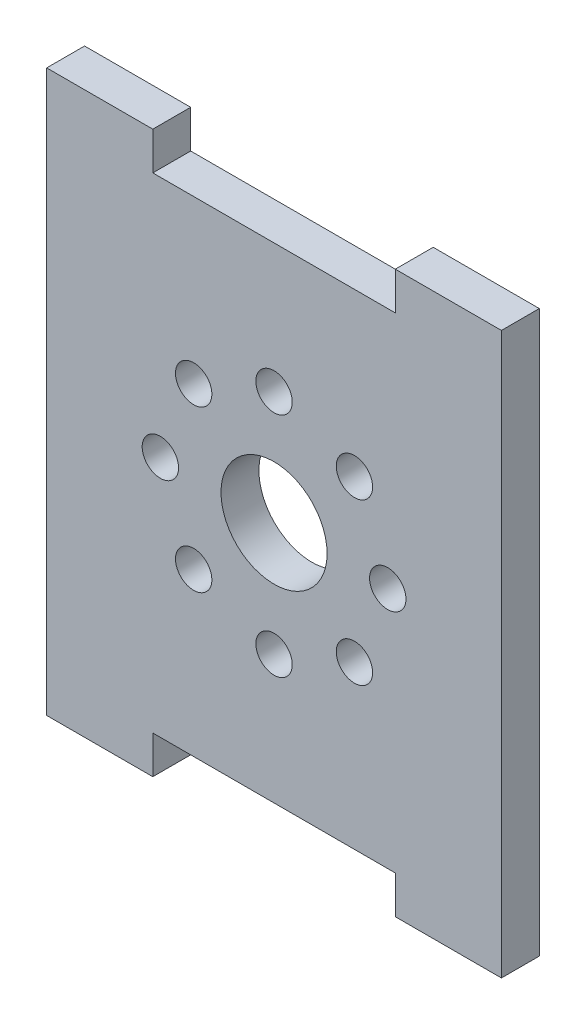
ISO-10303-21;
HEADER;
FILE_DESCRIPTION(('STEP AP214'),'2;1');
FILE_NAME('part.step','',(''),(''),'','','');
FILE_SCHEMA(('AUTOMOTIVE_DESIGN { 1 0 10303 214 1 1 1 1 }'));
ENDSEC;
DATA;
#1=APPLICATION_CONTEXT('core data for automotive mechanical design processes');
#2=APPLICATION_PROTOCOL_DEFINITION('international standard','automotive_design',2000,#1);
#3=PRODUCT_CONTEXT('',#1,'mechanical');
#4=PRODUCT('Part','Part','',(#3));
#5=PRODUCT_RELATED_PRODUCT_CATEGORY('part','',(#4));
#6=PRODUCT_DEFINITION_FORMATION('','',#4);
#7=PRODUCT_DEFINITION_CONTEXT('part definition',#1,'design');
#8=PRODUCT_DEFINITION('design','',#6,#7);
#9=PRODUCT_DEFINITION_SHAPE('','',#8);
#10=(LENGTH_UNIT() NAMED_UNIT(*) SI_UNIT(.MILLI.,.METRE.));
#11=(NAMED_UNIT(*) PLANE_ANGLE_UNIT() SI_UNIT($,.RADIAN.));
#12=(NAMED_UNIT(*) SI_UNIT($,.STERADIAN.) SOLID_ANGLE_UNIT());
#13=UNCERTAINTY_MEASURE_WITH_UNIT(LENGTH_MEASURE(1.E-05),#10,'distance_accuracy_value','');
#14=(GEOMETRIC_REPRESENTATION_CONTEXT(3) GLOBAL_UNCERTAINTY_ASSIGNED_CONTEXT((#13)) GLOBAL_UNIT_ASSIGNED_CONTEXT((#10,
#11,#12)) REPRESENTATION_CONTEXT('',''));
#15=CARTESIAN_POINT('',(0.,0.,0.));
#16=DIRECTION('',(0.,0.,1.));
#17=DIRECTION('',(1.,0.,0.));
#18=AXIS2_PLACEMENT_3D('',#15,#16,#17);
#19=CARTESIAN_POINT('',(0.,-16.,2.5));
#20=DIRECTION('',(0.,1.,0.));
#21=DIRECTION('',(0.,0.,1.));
#22=AXIS2_PLACEMENT_3D('',#19,#20,#21);
#23=PLANE('',#22);
#24=DIRECTION('',(1.,0.,0.));
#25=VECTOR('',#24,1.);
#26=CARTESIAN_POINT('',(0.,-16.,0.));
#27=LINE('',#26,#25);
#28=CARTESIAN_POINT('',(-8.,-16.,0.));
#29=VERTEX_POINT('',#28);
#30=CARTESIAN_POINT('',(8.,-16.,0.));
#31=VERTEX_POINT('',#30);
#32=EDGE_CURVE('E246',#29,#31,#27,.T.);
#33=ORIENTED_EDGE('',*,*,#32,.T.);
#34=DIRECTION('',(0.,0.,-1.));
#35=VECTOR('',#34,1.);
#36=CARTESIAN_POINT('',(8.,-16.,2.5));
#37=LINE('',#36,#35);
#38=CARTESIAN_POINT('',(8.,-16.,2.5));
#39=VERTEX_POINT('',#38);
#40=EDGE_CURVE('E11',#39,#31,#37,.T.);
#41=ORIENTED_EDGE('',*,*,#40,.F.);
#42=DIRECTION('',(1.,0.,0.));
#43=VECTOR('',#42,1.);
#44=CARTESIAN_POINT('',(0.,-16.,2.5));
#45=LINE('',#44,#43);
#46=CARTESIAN_POINT('',(-8.,-16.,2.5));
#47=VERTEX_POINT('',#46);
#48=EDGE_CURVE('E161',#47,#39,#45,.T.);
#49=ORIENTED_EDGE('',*,*,#48,.F.);
#50=DIRECTION('',(0.,0.,-1.));
#51=VECTOR('',#50,1.);
#52=CARTESIAN_POINT('',(-8.,-16.,2.5));
#53=LINE('',#52,#51);
#54=EDGE_CURVE('E51',#47,#29,#53,.T.);
#55=ORIENTED_EDGE('',*,*,#54,.T.);
#56=EDGE_LOOP('',(#33,#41,#49,#55));
#57=FACE_BOUND('',#56,.T.);
#58=ADVANCED_FACE('F34',(#57),#23,.F.);
#59=CARTESIAN_POINT('',(8.,0.,2.5));
#60=DIRECTION('',(1.,0.,0.));
#61=DIRECTION('',(0.,0.,-1.));
#62=AXIS2_PLACEMENT_3D('',#59,#60,#61);
#63=PLANE('',#62);
#64=DIRECTION('',(0.,-1.,0.));
#65=VECTOR('',#64,1.);
#66=CARTESIAN_POINT('',(8.,0.,0.));
#67=LINE('',#66,#65);
#68=CARTESIAN_POINT('',(8.,-18.5,0.));
#69=VERTEX_POINT('',#68);
#70=EDGE_CURVE('E248',#31,#69,#67,.T.);
#71=ORIENTED_EDGE('',*,*,#70,.T.);
#72=DIRECTION('',(0.,0.,-1.));
#73=VECTOR('',#72,1.);
#74=CARTESIAN_POINT('',(8.,-18.5,2.5));
#75=LINE('',#74,#73);
#76=CARTESIAN_POINT('',(8.,-18.5,2.5));
#77=VERTEX_POINT('',#76);
#78=EDGE_CURVE('E43',#77,#69,#75,.T.);
#79=ORIENTED_EDGE('',*,*,#78,.F.);
#80=DIRECTION('',(0.,-1.,0.));
#81=VECTOR('',#80,1.);
#82=CARTESIAN_POINT('',(8.,0.,2.5));
#83=LINE('',#82,#81);
#84=EDGE_CURVE('E101',#39,#77,#83,.T.);
#85=ORIENTED_EDGE('',*,*,#84,.F.);
#86=ORIENTED_EDGE('',*,*,#40,.T.);
#87=EDGE_LOOP('',(#71,#79,#85,#86));
#88=FACE_BOUND('',#87,.T.);
#89=ADVANCED_FACE('F292',(#88),#63,.F.);
#90=CARTESIAN_POINT('',(0.,-18.5,2.5));
#91=DIRECTION('',(0.,-1.,0.));
#92=DIRECTION('',(0.,0.,-1.));
#93=AXIS2_PLACEMENT_3D('',#90,#91,#92);
#94=PLANE('',#93);
#95=DIRECTION('',(-1.,0.,0.));
#96=VECTOR('',#95,1.);
#97=CARTESIAN_POINT('',(0.,-18.5,0.));
#98=LINE('',#97,#96);
#99=CARTESIAN_POINT('',(15.,-18.5,0.));
#100=VERTEX_POINT('',#99);
#101=EDGE_CURVE('E253',#100,#69,#98,.T.);
#102=ORIENTED_EDGE('',*,*,#101,.F.);
#103=DIRECTION('',(0.,0.,-1.));
#104=VECTOR('',#103,1.);
#105=CARTESIAN_POINT('',(15.,-18.5,2.5));
#106=LINE('',#105,#104);
#107=CARTESIAN_POINT('',(15.,-18.5,2.5));
#108=VERTEX_POINT('',#107);
#109=EDGE_CURVE('E289',#108,#100,#106,.T.);
#110=ORIENTED_EDGE('',*,*,#109,.F.);
#111=DIRECTION('',(-1.,0.,0.));
#112=VECTOR('',#111,1.);
#113=CARTESIAN_POINT('',(0.,-18.5,2.5));
#114=LINE('',#113,#112);
#115=EDGE_CURVE('E152',#108,#77,#114,.T.);
#116=ORIENTED_EDGE('',*,*,#115,.T.);
#117=ORIENTED_EDGE('',*,*,#78,.T.);
#118=EDGE_LOOP('',(#102,#110,#116,#117));
#119=FACE_BOUND('',#118,.T.);
#120=ADVANCED_FACE('F291',(#119),#94,.T.);
#121=CARTESIAN_POINT('',(15.,0.,2.5));
#122=DIRECTION('',(-1.,0.,0.));
#123=DIRECTION('',(0.,0.,1.));
#124=AXIS2_PLACEMENT_3D('',#121,#122,#123);
#125=PLANE('',#124);
#126=DIRECTION('',(0.,1.,0.));
#127=VECTOR('',#126,1.);
#128=CARTESIAN_POINT('',(15.,0.,0.));
#129=LINE('',#128,#127);
#130=CARTESIAN_POINT('',(15.,18.5,0.));
#131=VERTEX_POINT('',#130);
#132=EDGE_CURVE('E256',#100,#131,#129,.T.);
#133=ORIENTED_EDGE('',*,*,#132,.T.);
#134=DIRECTION('',(0.,0.,-1.));
#135=VECTOR('',#134,1.);
#136=CARTESIAN_POINT('',(15.,18.5,2.5));
#137=LINE('',#136,#135);
#138=CARTESIAN_POINT('',(15.,18.5,2.5));
#139=VERTEX_POINT('',#138);
#140=EDGE_CURVE('E286',#139,#131,#137,.T.);
#141=ORIENTED_EDGE('',*,*,#140,.F.);
#142=DIRECTION('',(0.,1.,0.));
#143=VECTOR('',#142,1.);
#144=CARTESIAN_POINT('',(15.,0.,2.5));
#145=LINE('',#144,#143);
#146=EDGE_CURVE('E157',#108,#139,#145,.T.);
#147=ORIENTED_EDGE('',*,*,#146,.F.);
#148=ORIENTED_EDGE('',*,*,#109,.T.);
#149=EDGE_LOOP('',(#133,#141,#147,#148));
#150=FACE_BOUND('',#149,.T.);
#151=ADVANCED_FACE('F299',(#150),#125,.F.);
#152=CARTESIAN_POINT('',(0.,18.5,2.5));
#153=DIRECTION('',(0.,-1.,0.));
#154=DIRECTION('',(0.,0.,-1.));
#155=AXIS2_PLACEMENT_3D('',#152,#153,#154);
#156=PLANE('',#155);
#157=DIRECTION('',(-1.,0.,0.));
#158=VECTOR('',#157,1.);
#159=CARTESIAN_POINT('',(0.,18.5,0.));
#160=LINE('',#159,#158);
#161=CARTESIAN_POINT('',(8.,18.5,0.));
#162=VERTEX_POINT('',#161);
#163=EDGE_CURVE('E259',#131,#162,#160,.T.);
#164=ORIENTED_EDGE('',*,*,#163,.T.);
#165=DIRECTION('',(0.,0.,-1.));
#166=VECTOR('',#165,1.);
#167=CARTESIAN_POINT('',(8.,18.5,2.5));
#168=LINE('',#167,#166);
#169=CARTESIAN_POINT('',(8.,18.5,2.5));
#170=VERTEX_POINT('',#169);
#171=EDGE_CURVE('E284',#170,#162,#168,.T.);
#172=ORIENTED_EDGE('',*,*,#171,.F.);
#173=DIRECTION('',(-1.,0.,0.));
#174=VECTOR('',#173,1.);
#175=CARTESIAN_POINT('',(0.,18.5,2.5));
#176=LINE('',#175,#174);
#177=EDGE_CURVE('E160',#139,#170,#176,.T.);
#178=ORIENTED_EDGE('',*,*,#177,.F.);
#179=ORIENTED_EDGE('',*,*,#140,.T.);
#180=EDGE_LOOP('',(#164,#172,#178,#179));
#181=FACE_BOUND('',#180,.T.);
#182=ADVANCED_FACE('F303',(#181),#156,.F.);
#183=CARTESIAN_POINT('',(8.,0.,2.5));
#184=DIRECTION('',(-1.,0.,0.));
#185=DIRECTION('',(0.,0.,1.));
#186=AXIS2_PLACEMENT_3D('',#183,#184,#185);
#187=PLANE('',#186);
#188=DIRECTION('',(0.,1.,0.));
#189=VECTOR('',#188,1.);
#190=CARTESIAN_POINT('',(8.,0.,0.));
#191=LINE('',#190,#189);
#192=CARTESIAN_POINT('',(8.,16.,0.));
#193=VERTEX_POINT('',#192);
#194=EDGE_CURVE('E262',#193,#162,#191,.T.);
#195=ORIENTED_EDGE('',*,*,#194,.F.);
#196=DIRECTION('',(0.,0.,-1.));
#197=VECTOR('',#196,1.);
#198=CARTESIAN_POINT('',(8.,16.,2.5));
#199=LINE('',#198,#197);
#200=CARTESIAN_POINT('',(8.,16.,2.5));
#201=VERTEX_POINT('',#200);
#202=EDGE_CURVE('E282',#201,#193,#199,.T.);
#203=ORIENTED_EDGE('',*,*,#202,.F.);
#204=DIRECTION('',(0.,1.,0.));
#205=VECTOR('',#204,1.);
#206=CARTESIAN_POINT('',(8.,0.,2.5));
#207=LINE('',#206,#205);
#208=EDGE_CURVE('E307',#201,#170,#207,.T.);
#209=ORIENTED_EDGE('',*,*,#208,.T.);
#210=ORIENTED_EDGE('',*,*,#171,.T.);
#211=EDGE_LOOP('',(#195,#203,#209,#210));
#212=FACE_BOUND('',#211,.T.);
#213=ADVANCED_FACE('F342',(#212),#187,.T.);
#214=CARTESIAN_POINT('',(0.,16.,2.5));
#215=DIRECTION('',(0.,-1.,0.));
#216=DIRECTION('',(0.,0.,-1.));
#217=AXIS2_PLACEMENT_3D('',#214,#215,#216);
#218=PLANE('',#217);
#219=DIRECTION('',(-1.,0.,0.));
#220=VECTOR('',#219,1.);
#221=CARTESIAN_POINT('',(0.,16.,0.));
#222=LINE('',#221,#220);
#223=CARTESIAN_POINT('',(-8.,16.,0.));
#224=VERTEX_POINT('',#223);
#225=EDGE_CURVE('E266',#193,#224,#222,.T.);
#226=ORIENTED_EDGE('',*,*,#225,.T.);
#227=DIRECTION('',(0.,0.,-1.));
#228=VECTOR('',#227,1.);
#229=CARTESIAN_POINT('',(-8.,16.,2.5));
#230=LINE('',#229,#228);
#231=CARTESIAN_POINT('',(-8.,16.,2.5));
#232=VERTEX_POINT('',#231);
#233=EDGE_CURVE('E279',#232,#224,#230,.T.);
#234=ORIENTED_EDGE('',*,*,#233,.F.);
#235=DIRECTION('',(-1.,0.,0.));
#236=VECTOR('',#235,1.);
#237=CARTESIAN_POINT('',(0.,16.,2.5));
#238=LINE('',#237,#236);
#239=EDGE_CURVE('E309',#201,#232,#238,.T.);
#240=ORIENTED_EDGE('',*,*,#239,.F.);
#241=ORIENTED_EDGE('',*,*,#202,.T.);
#242=EDGE_LOOP('',(#226,#234,#240,#241));
#243=FACE_BOUND('',#242,.T.);
#244=ADVANCED_FACE('F319',(#243),#218,.F.);
#245=CARTESIAN_POINT('',(-8.,0.,2.5));
#246=DIRECTION('',(-1.,0.,0.));
#247=DIRECTION('',(0.,0.,1.));
#248=AXIS2_PLACEMENT_3D('',#245,#246,#247);
#249=PLANE('',#248);
#250=DIRECTION('',(0.,1.,0.));
#251=VECTOR('',#250,1.);
#252=CARTESIAN_POINT('',(-8.,0.,0.));
#253=LINE('',#252,#251);
#254=CARTESIAN_POINT('',(-8.,18.5,0.));
#255=VERTEX_POINT('',#254);
#256=EDGE_CURVE('E268',#224,#255,#253,.T.);
#257=ORIENTED_EDGE('',*,*,#256,.T.);
#258=DIRECTION('',(0.,0.,-1.));
#259=VECTOR('',#258,1.);
#260=CARTESIAN_POINT('',(-8.,18.5,2.5));
#261=LINE('',#260,#259);
#262=CARTESIAN_POINT('',(-8.,18.5,2.5));
#263=VERTEX_POINT('',#262);
#264=EDGE_CURVE('E276',#263,#255,#261,.T.);
#265=ORIENTED_EDGE('',*,*,#264,.F.);
#266=DIRECTION('',(0.,1.,0.));
#267=VECTOR('',#266,1.);
#268=CARTESIAN_POINT('',(-8.,0.,2.5));
#269=LINE('',#268,#267);
#270=EDGE_CURVE('E311',#232,#263,#269,.T.);
#271=ORIENTED_EDGE('',*,*,#270,.F.);
#272=ORIENTED_EDGE('',*,*,#233,.T.);
#273=EDGE_LOOP('',(#257,#265,#271,#272));
#274=FACE_BOUND('',#273,.T.);
#275=ADVANCED_FACE('F323',(#274),#249,.F.);
#276=CARTESIAN_POINT('',(-15.,18.5,0.));
#277=VERTEX_POINT('',#276);
#278=EDGE_CURVE('E263',#255,#277,#160,.T.);
#279=ORIENTED_EDGE('',*,*,#278,.T.);
#280=DIRECTION('',(0.,0.,-1.));
#281=VECTOR('',#280,1.);
#282=CARTESIAN_POINT('',(-15.,18.5,2.5));
#283=LINE('',#282,#281);
#284=CARTESIAN_POINT('',(-15.,18.5,2.5));
#285=VERTEX_POINT('',#284);
#286=EDGE_CURVE('E138',#285,#277,#283,.T.);
#287=ORIENTED_EDGE('',*,*,#286,.F.);
#288=EDGE_CURVE('E146',#263,#285,#176,.T.);
#289=ORIENTED_EDGE('',*,*,#288,.F.);
#290=ORIENTED_EDGE('',*,*,#264,.T.);
#291=EDGE_LOOP('',(#279,#287,#289,#290));
#292=FACE_BOUND('',#291,.T.);
#293=ADVANCED_FACE('F327',(#292),#156,.F.);
#294=CARTESIAN_POINT('',(-15.,0.,2.5));
#295=DIRECTION('',(-1.,0.,0.));
#296=DIRECTION('',(0.,0.,1.));
#297=AXIS2_PLACEMENT_3D('',#294,#295,#296);
#298=PLANE('',#297);
#299=DIRECTION('',(0.,1.,0.));
#300=VECTOR('',#299,1.);
#301=CARTESIAN_POINT('',(-15.,0.,0.));
#302=LINE('',#301,#300);
#303=CARTESIAN_POINT('',(-15.,-18.5,0.));
#304=VERTEX_POINT('',#303);
#305=EDGE_CURVE('E134',#304,#277,#302,.T.);
#306=ORIENTED_EDGE('',*,*,#305,.F.);
#307=DIRECTION('',(0.,0.,-1.));
#308=VECTOR('',#307,1.);
#309=CARTESIAN_POINT('',(-15.,-18.5,2.5));
#310=LINE('',#309,#308);
#311=CARTESIAN_POINT('',(-15.,-18.5,2.5));
#312=VERTEX_POINT('',#311);
#313=EDGE_CURVE('E129',#312,#304,#310,.T.);
#314=ORIENTED_EDGE('',*,*,#313,.F.);
#315=DIRECTION('',(0.,1.,0.));
#316=VECTOR('',#315,1.);
#317=CARTESIAN_POINT('',(-15.,0.,2.5));
#318=LINE('',#317,#316);
#319=EDGE_CURVE('E132',#312,#285,#318,.T.);
#320=ORIENTED_EDGE('',*,*,#319,.T.);
#321=ORIENTED_EDGE('',*,*,#286,.T.);
#322=EDGE_LOOP('',(#306,#314,#320,#321));
#323=FACE_BOUND('',#322,.T.);
#324=ADVANCED_FACE('F131',(#323),#298,.T.);
#325=CARTESIAN_POINT('',(-8.,-18.5,0.));
#326=VERTEX_POINT('',#325);
#327=EDGE_CURVE('E257',#326,#304,#98,.T.);
#328=ORIENTED_EDGE('',*,*,#327,.F.);
#329=DIRECTION('',(0.,0.,-1.));
#330=VECTOR('',#329,1.);
#331=CARTESIAN_POINT('',(-8.,-18.5,2.5));
#332=LINE('',#331,#330);
#333=CARTESIAN_POINT('',(-8.,-18.5,2.5));
#334=VERTEX_POINT('',#333);
#335=EDGE_CURVE('E89',#334,#326,#332,.T.);
#336=ORIENTED_EDGE('',*,*,#335,.F.);
#337=EDGE_CURVE('E144',#334,#312,#114,.T.);
#338=ORIENTED_EDGE('',*,*,#337,.T.);
#339=ORIENTED_EDGE('',*,*,#313,.T.);
#340=EDGE_LOOP('',(#328,#336,#338,#339));
#341=FACE_BOUND('',#340,.T.);
#342=ADVANCED_FACE('F149',(#341),#94,.T.);
#343=CARTESIAN_POINT('',(0.,0.,2.5));
#344=DIRECTION('',(0.,0.,-1.));
#345=DIRECTION('',(-1.,0.,0.));
#346=AXIS2_PLACEMENT_3D('',#343,#344,#345);
#347=CYLINDRICAL_SURFACE('',#346,3.5);
#348=CARTESIAN_POINT('',(0.,0.,2.5));
#349=DIRECTION('',(0.,0.,1.));
#350=DIRECTION('',(1.,0.,0.));
#351=AXIS2_PLACEMENT_3D('',#348,#349,#350);
#352=CIRCLE('',#351,3.5);
#353=CARTESIAN_POINT('',(3.49999999999999,0.,2.5));
#354=VERTEX_POINT('',#353);
#355=EDGE_CURVE('E162',#354,#354,#352,.T.);
#356=ORIENTED_EDGE('',*,*,#355,.T.);
#357=EDGE_LOOP('',(#356));
#358=FACE_BOUND('',#357,.T.);
#359=CARTESIAN_POINT('',(0.,0.,0.));
#360=DIRECTION('',(0.,0.,1.));
#361=DIRECTION('',(1.,0.,0.));
#362=AXIS2_PLACEMENT_3D('',#359,#360,#361);
#363=CIRCLE('',#362,3.5);
#364=CARTESIAN_POINT('',(3.49999999999999,0.,0.));
#365=VERTEX_POINT('',#364);
#366=EDGE_CURVE('E171',#365,#365,#363,.T.);
#367=ORIENTED_EDGE('',*,*,#366,.F.);
#368=EDGE_LOOP('',(#367));
#369=FACE_BOUND('',#368,.T.);
#370=ADVANCED_FACE('F36',(#358,#369),#347,.F.);
#371=CARTESIAN_POINT('',(-8.,0.,2.5));
#372=DIRECTION('',(1.,0.,0.));
#373=DIRECTION('',(0.,0.,-1.));
#374=AXIS2_PLACEMENT_3D('',#371,#372,#373);
#375=PLANE('',#374);
#376=DIRECTION('',(0.,-1.,0.));
#377=VECTOR('',#376,1.);
#378=CARTESIAN_POINT('',(-8.,0.,0.));
#379=LINE('',#378,#377);
#380=EDGE_CURVE('E167',#29,#326,#379,.T.);
#381=ORIENTED_EDGE('',*,*,#380,.F.);
#382=ORIENTED_EDGE('',*,*,#54,.F.);
#383=DIRECTION('',(0.,-1.,0.));
#384=VECTOR('',#383,1.);
#385=CARTESIAN_POINT('',(-8.,0.,2.5));
#386=LINE('',#385,#384);
#387=EDGE_CURVE('E150',#47,#334,#386,.T.);
#388=ORIENTED_EDGE('',*,*,#387,.T.);
#389=ORIENTED_EDGE('',*,*,#335,.T.);
#390=EDGE_LOOP('',(#381,#382,#388,#389));
#391=FACE_BOUND('',#390,.T.);
#392=ADVANCED_FACE('F223',(#391),#375,.T.);
#393=CARTESIAN_POINT('',(0.,0.,2.5));
#394=DIRECTION('',(0.,0.,1.));
#395=DIRECTION('',(1.,0.,0.));
#396=AXIS2_PLACEMENT_3D('',#393,#394,#395);
#397=PLANE('',#396);
#398=CARTESIAN_POINT('',(-5.30330085889904,5.30330085889917,2.5));
#399=DIRECTION('',(0.,0.,1.));
#400=DIRECTION('',(1.,0.,0.));
#401=AXIS2_PLACEMENT_3D('',#398,#399,#400);
#402=CIRCLE('',#401,1.2);
#403=CARTESIAN_POINT('',(-4.10330085889904,5.30330085889917,2.5));
#404=VERTEX_POINT('',#403);
#405=EDGE_CURVE('E214',#404,#404,#402,.T.);
#406=ORIENTED_EDGE('',*,*,#405,.F.);
#407=EDGE_LOOP('',(#406));
#408=FACE_BOUND('',#407,.T.);
#409=CARTESIAN_POINT('',(-7.5,0.,2.5));
#410=DIRECTION('',(0.,0.,1.));
#411=DIRECTION('',(1.,0.,0.));
#412=AXIS2_PLACEMENT_3D('',#409,#410,#411);
#413=CIRCLE('',#412,1.2);
#414=CARTESIAN_POINT('',(-6.3,0.,2.5));
#415=VERTEX_POINT('',#414);
#416=EDGE_CURVE('E208',#415,#415,#413,.T.);
#417=ORIENTED_EDGE('',*,*,#416,.F.);
#418=EDGE_LOOP('',(#417));
#419=FACE_BOUND('',#418,.T.);
#420=CARTESIAN_POINT('',(-5.30330085889915,-5.30330085889906,2.5));
#421=DIRECTION('',(0.,0.,1.));
#422=DIRECTION('',(1.,0.,0.));
#423=AXIS2_PLACEMENT_3D('',#420,#421,#422);
#424=CIRCLE('',#423,1.2);
#425=CARTESIAN_POINT('',(-4.10330085889915,-5.30330085889906,2.5));
#426=VERTEX_POINT('',#425);
#427=EDGE_CURVE('E202',#426,#426,#424,.T.);
#428=ORIENTED_EDGE('',*,*,#427,.F.);
#429=EDGE_LOOP('',(#428));
#430=FACE_BOUND('',#429,.T.);
#431=CARTESIAN_POINT('',(0.,-7.5,2.5));
#432=DIRECTION('',(0.,0.,1.));
#433=DIRECTION('',(1.,0.,0.));
#434=AXIS2_PLACEMENT_3D('',#431,#432,#433);
#435=CIRCLE('',#434,1.2);
#436=CARTESIAN_POINT('',(1.2,-7.5,2.5));
#437=VERTEX_POINT('',#436);
#438=EDGE_CURVE('E196',#437,#437,#435,.T.);
#439=ORIENTED_EDGE('',*,*,#438,.F.);
#440=EDGE_LOOP('',(#439));
#441=FACE_BOUND('',#440,.T.);
#442=CARTESIAN_POINT('',(5.30330085889908,-5.30330085889913,2.5));
#443=DIRECTION('',(0.,0.,1.));
#444=DIRECTION('',(1.,0.,0.));
#445=AXIS2_PLACEMENT_3D('',#442,#443,#444);
#446=CIRCLE('',#445,1.2);
#447=CARTESIAN_POINT('',(6.50330085889908,-5.30330085889913,2.5));
#448=VERTEX_POINT('',#447);
#449=EDGE_CURVE('E190',#448,#448,#446,.T.);
#450=ORIENTED_EDGE('',*,*,#449,.F.);
#451=EDGE_LOOP('',(#450));
#452=FACE_BOUND('',#451,.T.);
#453=CARTESIAN_POINT('',(7.5,0.,2.5));
#454=DIRECTION('',(0.,0.,1.));
#455=DIRECTION('',(1.,0.,0.));
#456=AXIS2_PLACEMENT_3D('',#453,#454,#455);
#457=CIRCLE('',#456,1.2);
#458=CARTESIAN_POINT('',(8.7,0.,2.5));
#459=VERTEX_POINT('',#458);
#460=EDGE_CURVE('E184',#459,#459,#457,.T.);
#461=ORIENTED_EDGE('',*,*,#460,.F.);
#462=EDGE_LOOP('',(#461));
#463=FACE_BOUND('',#462,.T.);
#464=CARTESIAN_POINT('',(5.30330085889912,5.3033008588991,2.5));
#465=DIRECTION('',(0.,0.,1.));
#466=DIRECTION('',(1.,0.,0.));
#467=AXIS2_PLACEMENT_3D('',#464,#465,#466);
#468=CIRCLE('',#467,1.2);
#469=CARTESIAN_POINT('',(6.50330085889911,5.3033008588991,2.5));
#470=VERTEX_POINT('',#469);
#471=EDGE_CURVE('E178',#470,#470,#468,.T.);
#472=ORIENTED_EDGE('',*,*,#471,.F.);
#473=EDGE_LOOP('',(#472));
#474=FACE_BOUND('',#473,.T.);
#475=CARTESIAN_POINT('',(0.,7.5,2.5));
#476=DIRECTION('',(0.,0.,1.));
#477=DIRECTION('',(1.,0.,0.));
#478=AXIS2_PLACEMENT_3D('',#475,#476,#477);
#479=CIRCLE('',#478,1.2);
#480=CARTESIAN_POINT('',(1.2,7.5,2.5));
#481=VERTEX_POINT('',#480);
#482=EDGE_CURVE('E172',#481,#481,#479,.T.);
#483=ORIENTED_EDGE('',*,*,#482,.F.);
#484=EDGE_LOOP('',(#483));
#485=FACE_BOUND('',#484,.T.);
#486=ORIENTED_EDGE('',*,*,#355,.F.);
#487=EDGE_LOOP('',(#486));
#488=FACE_BOUND('',#487,.T.);
#489=ORIENTED_EDGE('',*,*,#48,.T.);
#490=ORIENTED_EDGE('',*,*,#84,.T.);
#491=ORIENTED_EDGE('',*,*,#115,.F.);
#492=ORIENTED_EDGE('',*,*,#146,.T.);
#493=ORIENTED_EDGE('',*,*,#177,.T.);
#494=ORIENTED_EDGE('',*,*,#208,.F.);
#495=ORIENTED_EDGE('',*,*,#239,.T.);
#496=ORIENTED_EDGE('',*,*,#270,.T.);
#497=ORIENTED_EDGE('',*,*,#288,.T.);
#498=ORIENTED_EDGE('',*,*,#319,.F.);
#499=ORIENTED_EDGE('',*,*,#337,.F.);
#500=ORIENTED_EDGE('',*,*,#387,.F.);
#501=EDGE_LOOP('',(#489,#490,#491,#492,#493,#494,#495,#496,#497,#498,#499,#500));
#502=FACE_BOUND('',#501,.T.);
#503=ADVANCED_FACE('F142',(#408,#419,#430,#441,#452,#463,#474,#485,#488,#502),#397,.T.);
#504=CARTESIAN_POINT('',(0.,0.,0.));
#505=DIRECTION('',(0.,0.,1.));
#506=DIRECTION('',(1.,0.,0.));
#507=AXIS2_PLACEMENT_3D('',#504,#505,#506);
#508=PLANE('',#507);
#509=CARTESIAN_POINT('',(-5.30330085889904,5.30330085889917,0.));
#510=DIRECTION('',(0.,0.,1.));
#511=DIRECTION('',(1.,0.,0.));
#512=AXIS2_PLACEMENT_3D('',#509,#510,#511);
#513=CIRCLE('',#512,1.2);
#514=CARTESIAN_POINT('',(-4.10330085889904,5.30330085889917,0.));
#515=VERTEX_POINT('',#514);
#516=EDGE_CURVE('E211',#515,#515,#513,.T.);
#517=ORIENTED_EDGE('',*,*,#516,.T.);
#518=EDGE_LOOP('',(#517));
#519=FACE_BOUND('',#518,.T.);
#520=CARTESIAN_POINT('',(-7.5,0.,0.));
#521=DIRECTION('',(0.,0.,1.));
#522=DIRECTION('',(1.,0.,0.));
#523=AXIS2_PLACEMENT_3D('',#520,#521,#522);
#524=CIRCLE('',#523,1.2);
#525=CARTESIAN_POINT('',(-6.3,0.,0.));
#526=VERTEX_POINT('',#525);
#527=EDGE_CURVE('E205',#526,#526,#524,.T.);
#528=ORIENTED_EDGE('',*,*,#527,.T.);
#529=EDGE_LOOP('',(#528));
#530=FACE_BOUND('',#529,.T.);
#531=CARTESIAN_POINT('',(-5.30330085889915,-5.30330085889906,0.));
#532=DIRECTION('',(0.,0.,1.));
#533=DIRECTION('',(1.,0.,0.));
#534=AXIS2_PLACEMENT_3D('',#531,#532,#533);
#535=CIRCLE('',#534,1.2);
#536=CARTESIAN_POINT('',(-4.10330085889915,-5.30330085889906,0.));
#537=VERTEX_POINT('',#536);
#538=EDGE_CURVE('E199',#537,#537,#535,.T.);
#539=ORIENTED_EDGE('',*,*,#538,.T.);
#540=EDGE_LOOP('',(#539));
#541=FACE_BOUND('',#540,.T.);
#542=CARTESIAN_POINT('',(0.,-7.5,0.));
#543=DIRECTION('',(0.,0.,1.));
#544=DIRECTION('',(1.,0.,0.));
#545=AXIS2_PLACEMENT_3D('',#542,#543,#544);
#546=CIRCLE('',#545,1.2);
#547=CARTESIAN_POINT('',(1.2,-7.5,0.));
#548=VERTEX_POINT('',#547);
#549=EDGE_CURVE('E193',#548,#548,#546,.T.);
#550=ORIENTED_EDGE('',*,*,#549,.T.);
#551=EDGE_LOOP('',(#550));
#552=FACE_BOUND('',#551,.T.);
#553=CARTESIAN_POINT('',(5.30330085889908,-5.30330085889913,0.));
#554=DIRECTION('',(0.,0.,1.));
#555=DIRECTION('',(1.,0.,0.));
#556=AXIS2_PLACEMENT_3D('',#553,#554,#555);
#557=CIRCLE('',#556,1.2);
#558=CARTESIAN_POINT('',(6.50330085889908,-5.30330085889913,0.));
#559=VERTEX_POINT('',#558);
#560=EDGE_CURVE('E187',#559,#559,#557,.T.);
#561=ORIENTED_EDGE('',*,*,#560,.T.);
#562=EDGE_LOOP('',(#561));
#563=FACE_BOUND('',#562,.T.);
#564=CARTESIAN_POINT('',(7.5,0.,0.));
#565=DIRECTION('',(0.,0.,1.));
#566=DIRECTION('',(1.,0.,0.));
#567=AXIS2_PLACEMENT_3D('',#564,#565,#566);
#568=CIRCLE('',#567,1.2);
#569=CARTESIAN_POINT('',(8.7,0.,0.));
#570=VERTEX_POINT('',#569);
#571=EDGE_CURVE('E181',#570,#570,#568,.T.);
#572=ORIENTED_EDGE('',*,*,#571,.T.);
#573=EDGE_LOOP('',(#572));
#574=FACE_BOUND('',#573,.T.);
#575=CARTESIAN_POINT('',(5.30330085889912,5.3033008588991,0.));
#576=DIRECTION('',(0.,0.,1.));
#577=DIRECTION('',(1.,0.,0.));
#578=AXIS2_PLACEMENT_3D('',#575,#576,#577);
#579=CIRCLE('',#578,1.2);
#580=CARTESIAN_POINT('',(6.50330085889911,5.3033008588991,0.));
#581=VERTEX_POINT('',#580);
#582=EDGE_CURVE('E175',#581,#581,#579,.T.);
#583=ORIENTED_EDGE('',*,*,#582,.T.);
#584=EDGE_LOOP('',(#583));
#585=FACE_BOUND('',#584,.T.);
#586=CARTESIAN_POINT('',(0.,7.5,0.));
#587=DIRECTION('',(0.,0.,1.));
#588=DIRECTION('',(1.,0.,0.));
#589=AXIS2_PLACEMENT_3D('',#586,#587,#588);
#590=CIRCLE('',#589,1.2);
#591=CARTESIAN_POINT('',(1.2,7.5,0.));
#592=VERTEX_POINT('',#591);
#593=EDGE_CURVE('E168',#592,#592,#590,.T.);
#594=ORIENTED_EDGE('',*,*,#593,.T.);
#595=EDGE_LOOP('',(#594));
#596=FACE_BOUND('',#595,.T.);
#597=ORIENTED_EDGE('',*,*,#366,.T.);
#598=EDGE_LOOP('',(#597));
#599=FACE_BOUND('',#598,.T.);
#600=ORIENTED_EDGE('',*,*,#32,.F.);
#601=ORIENTED_EDGE('',*,*,#380,.T.);
#602=ORIENTED_EDGE('',*,*,#327,.T.);
#603=ORIENTED_EDGE('',*,*,#305,.T.);
#604=ORIENTED_EDGE('',*,*,#278,.F.);
#605=ORIENTED_EDGE('',*,*,#256,.F.);
#606=ORIENTED_EDGE('',*,*,#225,.F.);
#607=ORIENTED_EDGE('',*,*,#194,.T.);
#608=ORIENTED_EDGE('',*,*,#163,.F.);
#609=ORIENTED_EDGE('',*,*,#132,.F.);
#610=ORIENTED_EDGE('',*,*,#101,.T.);
#611=ORIENTED_EDGE('',*,*,#70,.F.);
#612=EDGE_LOOP('',(#600,#601,#602,#603,#604,#605,#606,#607,#608,#609,#610,#611));
#613=FACE_BOUND('',#612,.T.);
#614=ADVANCED_FACE('F222',(#519,#530,#541,#552,#563,#574,#585,#596,#599,#613),#508,.F.);
#615=CARTESIAN_POINT('',(0.,7.5,2.5));
#616=DIRECTION('',(0.,0.,1.));
#617=DIRECTION('',(1.,0.,0.));
#618=AXIS2_PLACEMENT_3D('',#615,#616,#617);
#619=CYLINDRICAL_SURFACE('',#618,1.2);
#620=ORIENTED_EDGE('',*,*,#593,.F.);
#621=EDGE_LOOP('',(#620));
#622=FACE_BOUND('',#621,.T.);
#623=ORIENTED_EDGE('',*,*,#482,.T.);
#624=EDGE_LOOP('',(#623));
#625=FACE_BOUND('',#624,.T.);
#626=ADVANCED_FACE('F410',(#622,#625),#619,.F.);
#627=CARTESIAN_POINT('',(5.30330085889912,5.3033008588991,2.5));
#628=DIRECTION('',(0.,0.,1.));
#629=DIRECTION('',(1.,0.,0.));
#630=AXIS2_PLACEMENT_3D('',#627,#628,#629);
#631=CYLINDRICAL_SURFACE('',#630,1.2);
#632=ORIENTED_EDGE('',*,*,#582,.F.);
#633=EDGE_LOOP('',(#632));
#634=FACE_BOUND('',#633,.T.);
#635=ORIENTED_EDGE('',*,*,#471,.T.);
#636=EDGE_LOOP('',(#635));
#637=FACE_BOUND('',#636,.T.);
#638=ADVANCED_FACE('F415',(#634,#637),#631,.F.);
#639=CARTESIAN_POINT('',(7.5,0.,2.5));
#640=DIRECTION('',(0.,0.,1.));
#641=DIRECTION('',(1.,0.,0.));
#642=AXIS2_PLACEMENT_3D('',#639,#640,#641);
#643=CYLINDRICAL_SURFACE('',#642,1.2);
#644=ORIENTED_EDGE('',*,*,#571,.F.);
#645=EDGE_LOOP('',(#644));
#646=FACE_BOUND('',#645,.T.);
#647=ORIENTED_EDGE('',*,*,#460,.T.);
#648=EDGE_LOOP('',(#647));
#649=FACE_BOUND('',#648,.T.);
#650=ADVANCED_FACE('F438',(#646,#649),#643,.F.);
#651=CARTESIAN_POINT('',(5.30330085889908,-5.30330085889913,2.5));
#652=DIRECTION('',(0.,0.,1.));
#653=DIRECTION('',(1.,0.,0.));
#654=AXIS2_PLACEMENT_3D('',#651,#652,#653);
#655=CYLINDRICAL_SURFACE('',#654,1.2);
#656=ORIENTED_EDGE('',*,*,#560,.F.);
#657=EDGE_LOOP('',(#656));
#658=FACE_BOUND('',#657,.T.);
#659=ORIENTED_EDGE('',*,*,#449,.T.);
#660=EDGE_LOOP('',(#659));
#661=FACE_BOUND('',#660,.T.);
#662=ADVANCED_FACE('F448',(#658,#661),#655,.F.);
#663=CARTESIAN_POINT('',(0.,-7.5,2.5));
#664=DIRECTION('',(0.,0.,1.));
#665=DIRECTION('',(1.,0.,0.));
#666=AXIS2_PLACEMENT_3D('',#663,#664,#665);
#667=CYLINDRICAL_SURFACE('',#666,1.2);
#668=ORIENTED_EDGE('',*,*,#549,.F.);
#669=EDGE_LOOP('',(#668));
#670=FACE_BOUND('',#669,.T.);
#671=ORIENTED_EDGE('',*,*,#438,.T.);
#672=EDGE_LOOP('',(#671));
#673=FACE_BOUND('',#672,.T.);
#674=ADVANCED_FACE('F458',(#670,#673),#667,.F.);
#675=CARTESIAN_POINT('',(-5.30330085889915,-5.30330085889906,2.5));
#676=DIRECTION('',(0.,0.,1.));
#677=DIRECTION('',(1.,0.,0.));
#678=AXIS2_PLACEMENT_3D('',#675,#676,#677);
#679=CYLINDRICAL_SURFACE('',#678,1.2);
#680=ORIENTED_EDGE('',*,*,#538,.F.);
#681=EDGE_LOOP('',(#680));
#682=FACE_BOUND('',#681,.T.);
#683=ORIENTED_EDGE('',*,*,#427,.T.);
#684=EDGE_LOOP('',(#683));
#685=FACE_BOUND('',#684,.T.);
#686=ADVANCED_FACE('F468',(#682,#685),#679,.F.);
#687=CARTESIAN_POINT('',(-7.5,0.,2.5));
#688=DIRECTION('',(0.,0.,1.));
#689=DIRECTION('',(1.,0.,0.));
#690=AXIS2_PLACEMENT_3D('',#687,#688,#689);
#691=CYLINDRICAL_SURFACE('',#690,1.2);
#692=ORIENTED_EDGE('',*,*,#527,.F.);
#693=EDGE_LOOP('',(#692));
#694=FACE_BOUND('',#693,.T.);
#695=ORIENTED_EDGE('',*,*,#416,.T.);
#696=EDGE_LOOP('',(#695));
#697=FACE_BOUND('',#696,.T.);
#698=ADVANCED_FACE('F478',(#694,#697),#691,.F.);
#699=CARTESIAN_POINT('',(-5.30330085889904,5.30330085889917,2.5));
#700=DIRECTION('',(0.,0.,1.));
#701=DIRECTION('',(1.,0.,0.));
#702=AXIS2_PLACEMENT_3D('',#699,#700,#701);
#703=CYLINDRICAL_SURFACE('',#702,1.2);
#704=ORIENTED_EDGE('',*,*,#516,.F.);
#705=EDGE_LOOP('',(#704));
#706=FACE_BOUND('',#705,.T.);
#707=ORIENTED_EDGE('',*,*,#405,.T.);
#708=EDGE_LOOP('',(#707));
#709=FACE_BOUND('',#708,.T.);
#710=ADVANCED_FACE('F218',(#706,#709),#703,.F.);
#711=CLOSED_SHELL('',(#58,#89,#120,#151,#182,#213,#244,#275,#293,#324,#342,#370,#392,#503,#614,
#626,#638,#650,#662,#674,#686,#698,#710));
#712=MANIFOLD_SOLID_BREP('B2',#711);
#713=ADVANCED_BREP_SHAPE_REPRESENTATION('',(#18,#712),#14);
#714=SHAPE_DEFINITION_REPRESENTATION(#9,#713);
ENDSEC;
END-ISO-10303-21;
